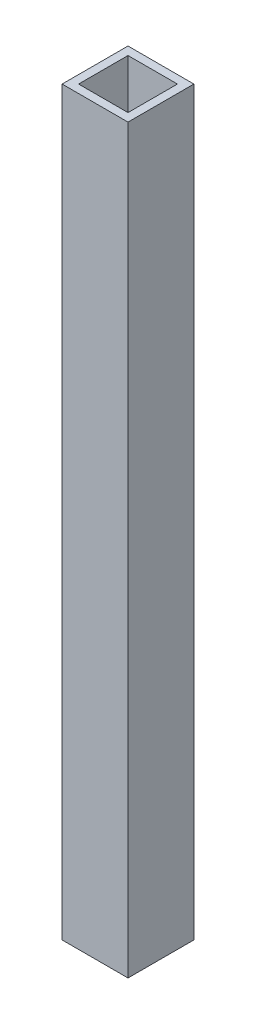
ISO-10303-21;
HEADER;
FILE_DESCRIPTION(('STEP AP214'),'2;1');
FILE_NAME('part.step','',(''),(''),'','','');
FILE_SCHEMA(('AUTOMOTIVE_DESIGN { 1 0 10303 214 1 1 1 1 }'));
ENDSEC;
DATA;
#1=APPLICATION_CONTEXT('core data for automotive mechanical design processes');
#2=APPLICATION_PROTOCOL_DEFINITION('international standard','automotive_design',2000,#1);
#3=PRODUCT_CONTEXT('',#1,'mechanical');
#4=PRODUCT('Part','Part','',(#3));
#5=PRODUCT_RELATED_PRODUCT_CATEGORY('part','',(#4));
#6=PRODUCT_DEFINITION_FORMATION('','',#4);
#7=PRODUCT_DEFINITION_CONTEXT('part definition',#1,'design');
#8=PRODUCT_DEFINITION('design','',#6,#7);
#9=PRODUCT_DEFINITION_SHAPE('','',#8);
#10=(LENGTH_UNIT() NAMED_UNIT(*) SI_UNIT(.MILLI.,.METRE.));
#11=(NAMED_UNIT(*) PLANE_ANGLE_UNIT() SI_UNIT($,.RADIAN.));
#12=(NAMED_UNIT(*) SI_UNIT($,.STERADIAN.) SOLID_ANGLE_UNIT());
#13=UNCERTAINTY_MEASURE_WITH_UNIT(LENGTH_MEASURE(1.E-05),#10,'distance_accuracy_value','');
#14=(GEOMETRIC_REPRESENTATION_CONTEXT(3) GLOBAL_UNCERTAINTY_ASSIGNED_CONTEXT((#13)) GLOBAL_UNIT_ASSIGNED_CONTEXT((#10,
#11,#12)) REPRESENTATION_CONTEXT('',''));
#15=CARTESIAN_POINT('',(0.,0.,0.));
#16=DIRECTION('',(0.,0.,1.));
#17=DIRECTION('',(1.,0.,0.));
#18=AXIS2_PLACEMENT_3D('',#15,#16,#17);
#19=CARTESIAN_POINT('',(0.,450.,0.));
#20=DIRECTION('',(0.,1.,0.));
#21=DIRECTION('',(0.,0.,1.));
#22=AXIS2_PLACEMENT_3D('',#19,#20,#21);
#23=PLANE('',#22);
#24=DIRECTION('',(0.,0.,1.));
#25=VECTOR('',#24,1.);
#26=CARTESIAN_POINT('',(-20.,450.,20.));
#27=LINE('',#26,#25);
#28=CARTESIAN_POINT('',(-20.,450.,-20.));
#29=VERTEX_POINT('',#28);
#30=CARTESIAN_POINT('',(-20.,450.,20.));
#31=VERTEX_POINT('',#30);
#32=EDGE_CURVE('E136',#29,#31,#27,.T.);
#33=ORIENTED_EDGE('',*,*,#32,.T.);
#34=DIRECTION('',(1.,0.,0.));
#35=VECTOR('',#34,1.);
#36=CARTESIAN_POINT('',(20.,450.,20.));
#37=LINE('',#36,#35);
#38=CARTESIAN_POINT('',(20.,450.,20.));
#39=VERTEX_POINT('',#38);
#40=EDGE_CURVE('E139',#31,#39,#37,.T.);
#41=ORIENTED_EDGE('',*,*,#40,.T.);
#42=DIRECTION('',(0.,0.,-1.));
#43=VECTOR('',#42,1.);
#44=CARTESIAN_POINT('',(20.,450.,20.));
#45=LINE('',#44,#43);
#46=CARTESIAN_POINT('',(20.,450.,-20.));
#47=VERTEX_POINT('',#46);
#48=EDGE_CURVE('E142',#39,#47,#45,.T.);
#49=ORIENTED_EDGE('',*,*,#48,.T.);
#50=DIRECTION('',(-1.,0.,0.));
#51=VECTOR('',#50,1.);
#52=CARTESIAN_POINT('',(20.,450.,-20.));
#53=LINE('',#52,#51);
#54=EDGE_CURVE('E144',#47,#29,#53,.T.);
#55=ORIENTED_EDGE('',*,*,#54,.T.);
#56=EDGE_LOOP('',(#33,#41,#49,#55));
#57=FACE_BOUND('',#56,.T.);
#58=DIRECTION('',(-1.,0.,0.));
#59=VECTOR('',#58,1.);
#60=CARTESIAN_POINT('',(15.,450.,-15.));
#61=LINE('',#60,#59);
#62=CARTESIAN_POINT('',(15.,450.,-15.));
#63=VERTEX_POINT('',#62);
#64=CARTESIAN_POINT('',(-15.,450.,-15.));
#65=VERTEX_POINT('',#64);
#66=EDGE_CURVE('E108',#63,#65,#61,.T.);
#67=ORIENTED_EDGE('',*,*,#66,.F.);
#68=DIRECTION('',(0.,0.,-1.));
#69=VECTOR('',#68,1.);
#70=CARTESIAN_POINT('',(15.,450.,15.));
#71=LINE('',#70,#69);
#72=CARTESIAN_POINT('',(15.,450.,15.));
#73=VERTEX_POINT('',#72);
#74=EDGE_CURVE('E100',#73,#63,#71,.T.);
#75=ORIENTED_EDGE('',*,*,#74,.F.);
#76=DIRECTION('',(1.,0.,0.));
#77=VECTOR('',#76,1.);
#78=CARTESIAN_POINT('',(15.,450.,15.));
#79=LINE('',#78,#77);
#80=CARTESIAN_POINT('',(-15.,450.,15.));
#81=VERTEX_POINT('',#80);
#82=EDGE_CURVE('E122',#81,#73,#79,.T.);
#83=ORIENTED_EDGE('',*,*,#82,.F.);
#84=DIRECTION('',(0.,0.,1.));
#85=VECTOR('',#84,1.);
#86=CARTESIAN_POINT('',(-15.,450.,15.));
#87=LINE('',#86,#85);
#88=EDGE_CURVE('E120',#65,#81,#87,.T.);
#89=ORIENTED_EDGE('',*,*,#88,.F.);
#90=EDGE_LOOP('',(#67,#75,#83,#89));
#91=FACE_BOUND('',#90,.T.);
#92=ADVANCED_FACE('F35',(#57,#91),#23,.T.);
#93=CARTESIAN_POINT('',(0.,0.,0.));
#94=DIRECTION('',(0.,1.,0.));
#95=DIRECTION('',(0.,0.,1.));
#96=AXIS2_PLACEMENT_3D('',#93,#94,#95);
#97=PLANE('',#96);
#98=DIRECTION('',(0.,0.,1.));
#99=VECTOR('',#98,1.);
#100=CARTESIAN_POINT('',(-20.,0.,20.));
#101=LINE('',#100,#99);
#102=CARTESIAN_POINT('',(-20.,0.,-20.));
#103=VERTEX_POINT('',#102);
#104=CARTESIAN_POINT('',(-20.,0.,20.));
#105=VERTEX_POINT('',#104);
#106=EDGE_CURVE('E116',#103,#105,#101,.T.);
#107=ORIENTED_EDGE('',*,*,#106,.F.);
#108=DIRECTION('',(-1.,0.,0.));
#109=VECTOR('',#108,1.);
#110=CARTESIAN_POINT('',(20.,0.,-20.));
#111=LINE('',#110,#109);
#112=CARTESIAN_POINT('',(20.,0.,-20.));
#113=VERTEX_POINT('',#112);
#114=EDGE_CURVE('E140',#113,#103,#111,.T.);
#115=ORIENTED_EDGE('',*,*,#114,.F.);
#116=DIRECTION('',(0.,0.,-1.));
#117=VECTOR('',#116,1.);
#118=CARTESIAN_POINT('',(20.,0.,20.));
#119=LINE('',#118,#117);
#120=CARTESIAN_POINT('',(20.,0.,20.));
#121=VERTEX_POINT('',#120);
#122=EDGE_CURVE('E151',#121,#113,#119,.T.);
#123=ORIENTED_EDGE('',*,*,#122,.F.);
#124=DIRECTION('',(1.,0.,0.));
#125=VECTOR('',#124,1.);
#126=CARTESIAN_POINT('',(20.,0.,20.));
#127=LINE('',#126,#125);
#128=EDGE_CURVE('E149',#105,#121,#127,.T.);
#129=ORIENTED_EDGE('',*,*,#128,.F.);
#130=EDGE_LOOP('',(#107,#115,#123,#129));
#131=FACE_BOUND('',#130,.T.);
#132=DIRECTION('',(0.,0.,-1.));
#133=VECTOR('',#132,1.);
#134=CARTESIAN_POINT('',(15.,0.,15.));
#135=LINE('',#134,#133);
#136=CARTESIAN_POINT('',(15.,0.,15.));
#137=VERTEX_POINT('',#136);
#138=CARTESIAN_POINT('',(15.,0.,-15.));
#139=VERTEX_POINT('',#138);
#140=EDGE_CURVE('E58',#137,#139,#135,.T.);
#141=ORIENTED_EDGE('',*,*,#140,.T.);
#142=DIRECTION('',(-1.,0.,0.));
#143=VECTOR('',#142,1.);
#144=CARTESIAN_POINT('',(15.,0.,-15.));
#145=LINE('',#144,#143);
#146=CARTESIAN_POINT('',(-15.,0.,-15.));
#147=VERTEX_POINT('',#146);
#148=EDGE_CURVE('E115',#139,#147,#145,.T.);
#149=ORIENTED_EDGE('',*,*,#148,.T.);
#150=DIRECTION('',(0.,0.,1.));
#151=VECTOR('',#150,1.);
#152=CARTESIAN_POINT('',(-15.,0.,15.));
#153=LINE('',#152,#151);
#154=CARTESIAN_POINT('',(-15.,0.,15.));
#155=VERTEX_POINT('',#154);
#156=EDGE_CURVE('E128',#147,#155,#153,.T.);
#157=ORIENTED_EDGE('',*,*,#156,.T.);
#158=DIRECTION('',(1.,0.,0.));
#159=VECTOR('',#158,1.);
#160=CARTESIAN_POINT('',(15.,0.,15.));
#161=LINE('',#160,#159);
#162=EDGE_CURVE('E109',#155,#137,#161,.T.);
#163=ORIENTED_EDGE('',*,*,#162,.T.);
#164=EDGE_LOOP('',(#141,#149,#157,#163));
#165=FACE_BOUND('',#164,.T.);
#166=ADVANCED_FACE('F169',(#131,#165),#97,.F.);
#167=CARTESIAN_POINT('',(-20.,450.,20.));
#168=DIRECTION('',(1.,0.,0.));
#169=DIRECTION('',(0.,0.,-1.));
#170=AXIS2_PLACEMENT_3D('',#167,#168,#169);
#171=PLANE('',#170);
#172=ORIENTED_EDGE('',*,*,#106,.T.);
#173=DIRECTION('',(0.,-1.,0.));
#174=VECTOR('',#173,1.);
#175=CARTESIAN_POINT('',(-20.,450.,20.));
#176=LINE('',#175,#174);
#177=EDGE_CURVE('E11',#31,#105,#176,.T.);
#178=ORIENTED_EDGE('',*,*,#177,.F.);
#179=ORIENTED_EDGE('',*,*,#32,.F.);
#180=DIRECTION('',(0.,-1.,0.));
#181=VECTOR('',#180,1.);
#182=CARTESIAN_POINT('',(-20.,450.,-20.));
#183=LINE('',#182,#181);
#184=EDGE_CURVE('E146',#29,#103,#183,.T.);
#185=ORIENTED_EDGE('',*,*,#184,.T.);
#186=EDGE_LOOP('',(#172,#178,#179,#185));
#187=FACE_BOUND('',#186,.T.);
#188=ADVANCED_FACE('F37',(#187),#171,.F.);
#189=CARTESIAN_POINT('',(20.,450.,20.));
#190=DIRECTION('',(0.,0.,-1.));
#191=DIRECTION('',(-1.,0.,0.));
#192=AXIS2_PLACEMENT_3D('',#189,#190,#191);
#193=PLANE('',#192);
#194=ORIENTED_EDGE('',*,*,#128,.T.);
#195=DIRECTION('',(0.,-1.,0.));
#196=VECTOR('',#195,1.);
#197=CARTESIAN_POINT('',(20.,450.,20.));
#198=LINE('',#197,#196);
#199=EDGE_CURVE('E43',#39,#121,#198,.T.);
#200=ORIENTED_EDGE('',*,*,#199,.F.);
#201=ORIENTED_EDGE('',*,*,#40,.F.);
#202=ORIENTED_EDGE('',*,*,#177,.T.);
#203=EDGE_LOOP('',(#194,#200,#201,#202));
#204=FACE_BOUND('',#203,.T.);
#205=ADVANCED_FACE('F179',(#204),#193,.F.);
#206=CARTESIAN_POINT('',(20.,450.,20.));
#207=DIRECTION('',(-1.,0.,0.));
#208=DIRECTION('',(0.,0.,1.));
#209=AXIS2_PLACEMENT_3D('',#206,#207,#208);
#210=PLANE('',#209);
#211=ORIENTED_EDGE('',*,*,#122,.T.);
#212=DIRECTION('',(0.,-1.,0.));
#213=VECTOR('',#212,1.);
#214=CARTESIAN_POINT('',(20.,450.,-20.));
#215=LINE('',#214,#213);
#216=EDGE_CURVE('E156',#47,#113,#215,.T.);
#217=ORIENTED_EDGE('',*,*,#216,.F.);
#218=ORIENTED_EDGE('',*,*,#48,.F.);
#219=ORIENTED_EDGE('',*,*,#199,.T.);
#220=EDGE_LOOP('',(#211,#217,#218,#219));
#221=FACE_BOUND('',#220,.T.);
#222=ADVANCED_FACE('F163',(#221),#210,.F.);
#223=CARTESIAN_POINT('',(20.,450.,-20.));
#224=DIRECTION('',(0.,0.,1.));
#225=DIRECTION('',(1.,0.,0.));
#226=AXIS2_PLACEMENT_3D('',#223,#224,#225);
#227=PLANE('',#226);
#228=ORIENTED_EDGE('',*,*,#114,.T.);
#229=ORIENTED_EDGE('',*,*,#184,.F.);
#230=ORIENTED_EDGE('',*,*,#54,.F.);
#231=ORIENTED_EDGE('',*,*,#216,.T.);
#232=EDGE_LOOP('',(#228,#229,#230,#231));
#233=FACE_BOUND('',#232,.T.);
#234=ADVANCED_FACE('F173',(#233),#227,.F.);
#235=CARTESIAN_POINT('',(15.,450.,15.));
#236=DIRECTION('',(-1.,0.,0.));
#237=DIRECTION('',(0.,0.,1.));
#238=AXIS2_PLACEMENT_3D('',#235,#236,#237);
#239=PLANE('',#238);
#240=ORIENTED_EDGE('',*,*,#140,.F.);
#241=DIRECTION('',(0.,-1.,0.));
#242=VECTOR('',#241,1.);
#243=CARTESIAN_POINT('',(15.,450.,15.));
#244=LINE('',#243,#242);
#245=EDGE_CURVE('E104',#73,#137,#244,.T.);
#246=ORIENTED_EDGE('',*,*,#245,.F.);
#247=ORIENTED_EDGE('',*,*,#74,.T.);
#248=DIRECTION('',(0.,-1.,0.));
#249=VECTOR('',#248,1.);
#250=CARTESIAN_POINT('',(15.,450.,-15.));
#251=LINE('',#250,#249);
#252=EDGE_CURVE('E103',#63,#139,#251,.T.);
#253=ORIENTED_EDGE('',*,*,#252,.T.);
#254=EDGE_LOOP('',(#240,#246,#247,#253));
#255=FACE_BOUND('',#254,.T.);
#256=ADVANCED_FACE('F102',(#255),#239,.T.);
#257=CARTESIAN_POINT('',(15.,450.,-15.));
#258=DIRECTION('',(0.,0.,1.));
#259=DIRECTION('',(1.,0.,0.));
#260=AXIS2_PLACEMENT_3D('',#257,#258,#259);
#261=PLANE('',#260);
#262=ORIENTED_EDGE('',*,*,#148,.F.);
#263=ORIENTED_EDGE('',*,*,#252,.F.);
#264=ORIENTED_EDGE('',*,*,#66,.T.);
#265=DIRECTION('',(0.,-1.,0.));
#266=VECTOR('',#265,1.);
#267=CARTESIAN_POINT('',(-15.,450.,-15.));
#268=LINE('',#267,#266);
#269=EDGE_CURVE('E117',#65,#147,#268,.T.);
#270=ORIENTED_EDGE('',*,*,#269,.T.);
#271=EDGE_LOOP('',(#262,#263,#264,#270));
#272=FACE_BOUND('',#271,.T.);
#273=ADVANCED_FACE('F112',(#272),#261,.T.);
#274=CARTESIAN_POINT('',(-15.,450.,15.));
#275=DIRECTION('',(1.,0.,0.));
#276=DIRECTION('',(0.,0.,-1.));
#277=AXIS2_PLACEMENT_3D('',#274,#275,#276);
#278=PLANE('',#277);
#279=ORIENTED_EDGE('',*,*,#156,.F.);
#280=ORIENTED_EDGE('',*,*,#269,.F.);
#281=ORIENTED_EDGE('',*,*,#88,.T.);
#282=DIRECTION('',(0.,-1.,0.));
#283=VECTOR('',#282,1.);
#284=CARTESIAN_POINT('',(-15.,450.,15.));
#285=LINE('',#284,#283);
#286=EDGE_CURVE('E50',#81,#155,#285,.T.);
#287=ORIENTED_EDGE('',*,*,#286,.T.);
#288=EDGE_LOOP('',(#279,#280,#281,#287));
#289=FACE_BOUND('',#288,.T.);
#290=ADVANCED_FACE('F202',(#289),#278,.T.);
#291=CARTESIAN_POINT('',(15.,450.,15.));
#292=DIRECTION('',(0.,0.,-1.));
#293=DIRECTION('',(-1.,0.,0.));
#294=AXIS2_PLACEMENT_3D('',#291,#292,#293);
#295=PLANE('',#294);
#296=ORIENTED_EDGE('',*,*,#162,.F.);
#297=ORIENTED_EDGE('',*,*,#286,.F.);
#298=ORIENTED_EDGE('',*,*,#82,.T.);
#299=ORIENTED_EDGE('',*,*,#245,.T.);
#300=EDGE_LOOP('',(#296,#297,#298,#299));
#301=FACE_BOUND('',#300,.T.);
#302=ADVANCED_FACE('F206',(#301),#295,.T.);
#303=CLOSED_SHELL('',(#92,#166,#188,#205,#222,#234,#256,#273,#290,#302));
#304=MANIFOLD_SOLID_BREP('B2',#303);
#305=ADVANCED_BREP_SHAPE_REPRESENTATION('',(#18,#304),#14);
#306=SHAPE_DEFINITION_REPRESENTATION(#9,#305);
ENDSEC;
END-ISO-10303-21;
